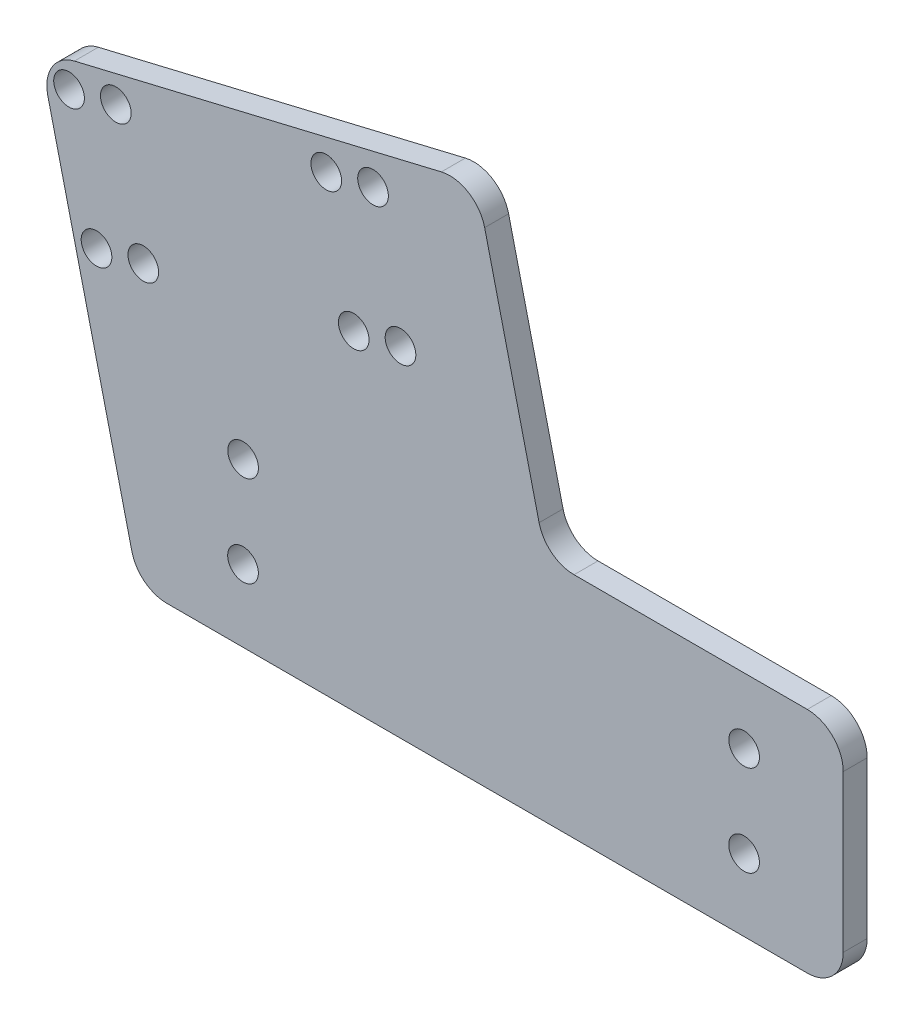
ISO-10303-21;
HEADER;
FILE_DESCRIPTION(('STEP AP214'),'2;1');
FILE_NAME('part.step','',(''),(''),'','','');
FILE_SCHEMA(('AUTOMOTIVE_DESIGN { 1 0 10303 214 1 1 1 1 }'));
ENDSEC;
DATA;
#1=APPLICATION_CONTEXT('core data for automotive mechanical design processes');
#2=APPLICATION_PROTOCOL_DEFINITION('international standard','automotive_design',2000,#1);
#3=PRODUCT_CONTEXT('',#1,'mechanical');
#4=PRODUCT('Part','Part','',(#3));
#5=PRODUCT_RELATED_PRODUCT_CATEGORY('part','',(#4));
#6=PRODUCT_DEFINITION_FORMATION('','',#4);
#7=PRODUCT_DEFINITION_CONTEXT('part definition',#1,'design');
#8=PRODUCT_DEFINITION('design','',#6,#7);
#9=PRODUCT_DEFINITION_SHAPE('','',#8);
#10=(LENGTH_UNIT() NAMED_UNIT(*) SI_UNIT(.MILLI.,.METRE.));
#11=(NAMED_UNIT(*) PLANE_ANGLE_UNIT() SI_UNIT($,.RADIAN.));
#12=(NAMED_UNIT(*) SI_UNIT($,.STERADIAN.) SOLID_ANGLE_UNIT());
#13=UNCERTAINTY_MEASURE_WITH_UNIT(LENGTH_MEASURE(1.E-05),#10,'distance_accuracy_value','');
#14=(GEOMETRIC_REPRESENTATION_CONTEXT(3) GLOBAL_UNCERTAINTY_ASSIGNED_CONTEXT((#13)) GLOBAL_UNIT_ASSIGNED_CONTEXT((#10,
#11,#12)) REPRESENTATION_CONTEXT('',''));
#15=CARTESIAN_POINT('',(0.,0.,0.));
#16=DIRECTION('',(0.,0.,1.));
#17=DIRECTION('',(1.,0.,0.));
#18=AXIS2_PLACEMENT_3D('',#15,#16,#17);
#19=CARTESIAN_POINT('',(0.,0.,3.175));
#20=DIRECTION('',(0.,0.,-1.));
#21=DIRECTION('',(-1.,0.,0.));
#22=AXIS2_PLACEMENT_3D('',#19,#20,#21);
#23=PLANE('',#22);
#24=DIRECTION('',(0.231932512239385,-0.972731879690559,0.));
#25=VECTOR('',#24,1.);
#26=CARTESIAN_POINT('',(-27.4104436947697,-16.4623335026394,3.175));
#27=LINE('',#26,#25);
#28=CARTESIAN_POINT('',(-39.4259118425008,33.9308985796357,3.175));
#29=VERTEX_POINT('',#28);
#30=CARTESIAN_POINT('',(-28.2826171271569,-12.8044120921795,3.175));
#31=VERTEX_POINT('',#30);
#32=EDGE_CURVE('E174',#29,#31,#27,.T.);
#33=ORIENTED_EDGE('',*,*,#32,.T.);
#34=CARTESIAN_POINT('',(-23.6499815501307,-11.6998335026394,3.175));
#35=DIRECTION('',(0.,0.,-1.));
#36=DIRECTION('',(-1.,0.,0.));
#37=AXIS2_PLACEMENT_3D('',#34,#35,#36);
#38=CIRCLE('',#37,4.7625);
#39=CARTESIAN_POINT('',(-23.6499815501307,-16.4623335026394,3.175));
#40=VERTEX_POINT('',#39);
#41=EDGE_CURVE('E193',#31,#40,#38,.F.);
#42=ORIENTED_EDGE('',*,*,#41,.T.);
#43=DIRECTION('',(1.,0.,0.));
#44=VECTOR('',#43,1.);
#45=CARTESIAN_POINT('',(66.017725222861,-16.4623335026394,3.175));
#46=LINE('',#45,#44);
#47=CARTESIAN_POINT('',(61.255225222861,-16.4623335026394,3.175));
#48=VERTEX_POINT('',#47);
#49=EDGE_CURVE('E151',#40,#48,#46,.T.);
#50=ORIENTED_EDGE('',*,*,#49,.T.);
#51=CARTESIAN_POINT('',(61.255225222861,-11.6998335026394,3.175));
#52=DIRECTION('',(0.,0.,-1.));
#53=DIRECTION('',(-1.,0.,0.));
#54=AXIS2_PLACEMENT_3D('',#51,#52,#53);
#55=CIRCLE('',#54,4.7625);
#56=CARTESIAN_POINT('',(66.017725222861,-11.6998335026394,3.175));
#57=VERTEX_POINT('',#56);
#58=EDGE_CURVE('E195',#48,#57,#55,.F.);
#59=ORIENTED_EDGE('',*,*,#58,.T.);
#60=DIRECTION('',(0.,1.,0.));
#61=VECTOR('',#60,1.);
#62=CARTESIAN_POINT('',(66.017725222861,13.8136132691094,3.175));
#63=LINE('',#62,#61);
#64=CARTESIAN_POINT('',(66.017725222861,9.05111326910943,3.175));
#65=VERTEX_POINT('',#64);
#66=EDGE_CURVE('E234',#57,#65,#63,.T.);
#67=ORIENTED_EDGE('',*,*,#66,.T.);
#68=CARTESIAN_POINT('',(61.255225222861,9.05111326910943,3.175));
#69=DIRECTION('',(0.,0.,-1.));
#70=DIRECTION('',(-1.,0.,0.));
#71=AXIS2_PLACEMENT_3D('',#68,#69,#70);
#72=CIRCLE('',#71,4.7625);
#73=CARTESIAN_POINT('',(61.255225222861,13.8136132691094,3.175));
#74=VERTEX_POINT('',#73);
#75=EDGE_CURVE('E189',#65,#74,#72,.F.);
#76=ORIENTED_EDGE('',*,*,#75,.T.);
#77=DIRECTION('',(-1.,0.,0.));
#78=VECTOR('',#77,1.);
#79=CARTESIAN_POINT('',(26.5741517757793,13.8136132691094,3.175));
#80=LINE('',#79,#78);
#81=CARTESIAN_POINT('',(30.3346139204183,13.8136132691094,3.175));
#82=VERTEX_POINT('',#81);
#83=EDGE_CURVE('E229',#74,#82,#80,.T.);
#84=ORIENTED_EDGE('',*,*,#83,.T.);
#85=CARTESIAN_POINT('',(30.3346139204183,18.5761132691094,3.175));
#86=DIRECTION('',(0.,0.,-1.));
#87=DIRECTION('',(-1.,0.,0.));
#88=AXIS2_PLACEMENT_3D('',#85,#86,#87);
#89=CIRCLE('',#88,4.7625);
#90=CARTESIAN_POINT('',(25.7019783433921,17.4715346795693,3.175));
#91=VERTEX_POINT('',#90);
#92=EDGE_CURVE('E11',#82,#91,#89,.T.);
#93=ORIENTED_EDGE('',*,*,#92,.T.);
#94=DIRECTION('',(-0.231932512239385,0.972731879690559,0.));
#95=VECTOR('',#94,1.);
#96=CARTESIAN_POINT('',(17.3806287150141,52.3715234194829,3.175));
#97=LINE('',#96,#95);
#98=CARTESIAN_POINT('',(18.4852073045542,47.7388878424566,3.175));
#99=VERTEX_POINT('',#98);
#100=EDGE_CURVE('E228',#91,#99,#97,.T.);
#101=ORIENTED_EDGE('',*,*,#100,.T.);
#102=CARTESIAN_POINT('',(13.8525717275279,46.6343092529165,3.175));
#103=DIRECTION('',(0.,0.,-1.));
#104=DIRECTION('',(-1.,0.,0.));
#105=AXIS2_PLACEMENT_3D('',#102,#103,#104);
#106=CIRCLE('',#105,4.7625);
#107=CARTESIAN_POINT('',(12.7479931379878,51.2669448299428,3.175));
#108=VERTEX_POINT('',#107);
#109=EDGE_CURVE('E62',#99,#108,#106,.F.);
#110=ORIENTED_EDGE('',*,*,#109,.T.);
#111=DIRECTION('',(-0.972731879690559,-0.231932512239385,0.));
#112=VECTOR('',#111,1.);
#113=CARTESIAN_POINT('',(-40.5304904320408,38.563534156662,3.175));
#114=LINE('',#113,#112);
#115=CARTESIAN_POINT('',(-35.8978548550145,39.6681127462021,3.175));
#116=VERTEX_POINT('',#115);
#117=EDGE_CURVE('E176',#108,#116,#114,.T.);
#118=ORIENTED_EDGE('',*,*,#117,.T.);
#119=CARTESIAN_POINT('',(-34.7932762654745,35.0354771691758,3.175));
#120=DIRECTION('',(0.,0.,-1.));
#121=DIRECTION('',(-1.,0.,0.));
#122=AXIS2_PLACEMENT_3D('',#119,#120,#121);
#123=CIRCLE('',#122,4.7625);
#124=EDGE_CURVE('E190',#116,#29,#123,.F.);
#125=ORIENTED_EDGE('',*,*,#124,.T.);
#126=EDGE_LOOP('',(#33,#42,#50,#59,#67,#76,#84,#93,#101,#110,#118,#125));
#127=FACE_BOUND('',#126,.T.);
#128=CARTESIAN_POINT('',(-36.6096185651346,36.0526458125349,3.175));
#129=DIRECTION('',(0.,0.,1.));
#130=DIRECTION('',(1.,0.,0.));
#131=AXIS2_PLACEMENT_3D('',#128,#129,#130);
#132=CIRCLE('',#131,2.03200000000001);
#133=CARTESIAN_POINT('',(-34.5776185651346,36.0526458125349,3.175));
#134=VERTEX_POINT('',#133);
#135=EDGE_CURVE('E163',#134,#134,#132,.T.);
#136=ORIENTED_EDGE('',*,*,#135,.F.);
#137=EDGE_LOOP('',(#136));
#138=FACE_BOUND('',#137,.T.);
#139=CARTESIAN_POINT('',(-30.410138919923,37.4270373610419,3.175));
#140=DIRECTION('',(0.,0.,1.));
#141=DIRECTION('',(1.,0.,0.));
#142=AXIS2_PLACEMENT_3D('',#139,#140,#141);
#143=CIRCLE('',#142,2.03199999999999);
#144=CARTESIAN_POINT('',(-28.378138919923,37.4270373610419,3.175));
#145=VERTEX_POINT('',#144);
#146=EDGE_CURVE('E244',#145,#145,#143,.T.);
#147=ORIENTED_EDGE('',*,*,#146,.F.);
#148=EDGE_LOOP('',(#147));
#149=FACE_BOUND('',#148,.T.);
#150=CARTESIAN_POINT('',(-32.9674809615911,19.6240247527242,3.175));
#151=DIRECTION('',(0.,0.,1.));
#152=DIRECTION('',(1.,0.,0.));
#153=AXIS2_PLACEMENT_3D('',#150,#151,#152);
#154=CIRCLE('',#153,2.032);
#155=CARTESIAN_POINT('',(-30.9354809615911,19.6240247527242,3.175));
#156=VERTEX_POINT('',#155);
#157=EDGE_CURVE('E253',#156,#156,#154,.T.);
#158=ORIENTED_EDGE('',*,*,#157,.F.);
#159=EDGE_LOOP('',(#158));
#160=FACE_BOUND('',#159,.T.);
#161=CARTESIAN_POINT('',(7.32913673316396,28.5575698180374,3.175));
#162=DIRECTION('',(0.,0.,1.));
#163=DIRECTION('',(1.,0.,0.));
#164=AXIS2_PLACEMENT_3D('',#161,#162,#163);
#165=CIRCLE('',#164,2.03199999999999);
#166=CARTESIAN_POINT('',(9.36113673316396,28.5575698180374,3.175));
#167=VERTEX_POINT('',#166);
#168=EDGE_CURVE('E260',#167,#167,#165,.T.);
#169=ORIENTED_EDGE('',*,*,#168,.F.);
#170=EDGE_LOOP('',(#169));
#171=FACE_BOUND('',#170,.T.);
#172=CARTESIAN_POINT('',(3.68699912962051,44.9861908778481,3.175));
#173=DIRECTION('',(0.,0.,1.));
#174=DIRECTION('',(1.,0.,0.));
#175=AXIS2_PLACEMENT_3D('',#172,#173,#174);
#176=CIRCLE('',#175,2.03199999999998);
#177=CARTESIAN_POINT('',(5.71899912962048,44.9861908778481,3.175));
#178=VERTEX_POINT('',#177);
#179=EDGE_CURVE('E263',#178,#178,#176,.T.);
#180=ORIENTED_EDGE('',*,*,#179,.F.);
#181=EDGE_LOOP('',(#180));
#182=FACE_BOUND('',#181,.T.);
#183=CARTESIAN_POINT('',(-2.51248051559105,43.6117993293412,3.175));
#184=DIRECTION('',(0.,0.,1.));
#185=DIRECTION('',(1.,0.,0.));
#186=AXIS2_PLACEMENT_3D('',#183,#184,#185);
#187=CIRCLE('',#186,2.032);
#188=CARTESIAN_POINT('',(-0.480480515591052,43.6117993293412,3.175));
#189=VERTEX_POINT('',#188);
#190=EDGE_CURVE('E267',#189,#189,#187,.T.);
#191=ORIENTED_EDGE('',*,*,#190,.F.);
#192=EDGE_LOOP('',(#191));
#193=FACE_BOUND('',#192,.T.);
#194=CARTESIAN_POINT('',(1.12965708795237,27.1831782695305,3.175));
#195=DIRECTION('',(0.,0.,1.));
#196=DIRECTION('',(1.,0.,0.));
#197=AXIS2_PLACEMENT_3D('',#194,#195,#196);
#198=CIRCLE('',#197,2.03199999999997);
#199=CARTESIAN_POINT('',(3.16165708795235,27.1831782695305,3.175));
#200=VERTEX_POINT('',#199);
#201=EDGE_CURVE('E274',#200,#200,#198,.T.);
#202=ORIENTED_EDGE('',*,*,#201,.F.);
#203=EDGE_LOOP('',(#202));
#204=FACE_BOUND('',#203,.T.);
#205=CARTESIAN_POINT('',(-26.7680013163795,20.9984163012312,3.175));
#206=DIRECTION('',(0.,0.,1.));
#207=DIRECTION('',(1.,0.,0.));
#208=AXIS2_PLACEMENT_3D('',#205,#206,#207);
#209=CIRCLE('',#208,2.032);
#210=CARTESIAN_POINT('',(-24.7360013163795,20.9984163012312,3.175));
#211=VERTEX_POINT('',#210);
#212=EDGE_CURVE('E281',#211,#211,#209,.T.);
#213=ORIENTED_EDGE('',*,*,#212,.F.);
#214=EDGE_LOOP('',(#213));
#215=FACE_BOUND('',#214,.T.);
#216=CARTESIAN_POINT('',(52.883061118148,5.13586566594492,3.175));
#217=DIRECTION('',(0.,0.,1.));
#218=DIRECTION('',(1.74155309596097E-13,1.,0.));
#219=AXIS2_PLACEMENT_3D('',#216,#217,#218);
#220=ELLIPSE('',#219,2.032,2.03199950216018);
#221=CARTESIAN_POINT('',(52.8830611181484,7.16786566594492,3.175));
#222=VERTEX_POINT('',#221);
#223=EDGE_CURVE('E290',#222,#222,#220,.T.);
#224=ORIENTED_EDGE('',*,*,#223,.F.);
#225=EDGE_LOOP('',(#224));
#226=FACE_BOUND('',#225,.T.);
#227=CARTESIAN_POINT('',(52.8750601201143,-6.9291343340733,3.175));
#228=DIRECTION('',(0.,0.,1.));
#229=DIRECTION('',(1.,0.,0.));
#230=AXIS2_PLACEMENT_3D('',#227,#228,#229);
#231=CIRCLE('',#230,2.03200000000001);
#232=CARTESIAN_POINT('',(54.9070601201143,-6.9291343340733,3.175));
#233=VERTEX_POINT('',#232);
#234=EDGE_CURVE('E291',#233,#233,#231,.T.);
#235=ORIENTED_EDGE('',*,*,#234,.F.);
#236=EDGE_LOOP('',(#235));
#237=FACE_BOUND('',#236,.T.);
#238=CARTESIAN_POINT('',(-13.5459236067466,-6.9291343340733,3.175));
#239=DIRECTION('',(0.,0.,1.));
#240=DIRECTION('',(1.,0.,0.));
#241=AXIS2_PLACEMENT_3D('',#238,#239,#240);
#242=CIRCLE('',#241,2.03200000000001);
#243=CARTESIAN_POINT('',(-11.5139236067466,-6.9291343340733,3.175));
#244=VERTEX_POINT('',#243);
#245=EDGE_CURVE('E574',#244,#244,#242,.T.);
#246=ORIENTED_EDGE('',*,*,#245,.F.);
#247=EDGE_LOOP('',(#246));
#248=FACE_BOUND('',#247,.T.);
#249=CARTESIAN_POINT('',(-13.5379226087129,5.13586566594492,3.175));
#250=DIRECTION('',(0.,0.,1.));
#251=DIRECTION('',(1.75009012094116E-13,1.,0.));
#252=AXIS2_PLACEMENT_3D('',#249,#250,#251);
#253=ELLIPSE('',#252,2.03200000000001,2.03199950216019);
#254=CARTESIAN_POINT('',(-13.5379226087125,7.16786566594492,3.175));
#255=VERTEX_POINT('',#254);
#256=EDGE_CURVE('E583',#255,#255,#253,.T.);
#257=ORIENTED_EDGE('',*,*,#256,.F.);
#258=EDGE_LOOP('',(#257));
#259=FACE_BOUND('',#258,.T.);
#260=ADVANCED_FACE('F41',(#127,#138,#149,#160,#171,#182,#193,#204,#215,#226,#237,#248,#259),#23,.F.);
#261=CARTESIAN_POINT('',(0.,0.,0.));
#262=DIRECTION('',(0.,0.,-1.));
#263=DIRECTION('',(-1.,0.,0.));
#264=AXIS2_PLACEMENT_3D('',#261,#262,#263);
#265=PLANE('',#264);
#266=CARTESIAN_POINT('',(-13.5459236067466,-6.9291343340733,0.));
#267=DIRECTION('',(0.,0.,1.));
#268=DIRECTION('',(1.,0.,0.));
#269=AXIS2_PLACEMENT_3D('',#266,#267,#268);
#270=CIRCLE('',#269,2.03200000000001);
#271=CARTESIAN_POINT('',(-11.5139236067466,-6.9291343340733,0.));
#272=VERTEX_POINT('',#271);
#273=EDGE_CURVE('E580',#272,#272,#270,.T.);
#274=ORIENTED_EDGE('',*,*,#273,.T.);
#275=EDGE_LOOP('',(#274));
#276=FACE_BOUND('',#275,.T.);
#277=CARTESIAN_POINT('',(52.883061118148,5.13586566594492,0.));
#278=DIRECTION('',(0.,0.,1.));
#279=DIRECTION('',(1.74155309596097E-13,1.,0.));
#280=AXIS2_PLACEMENT_3D('',#277,#278,#279);
#281=ELLIPSE('',#280,2.032,2.03199950216018);
#282=CARTESIAN_POINT('',(52.8830611181484,7.16786566594492,0.));
#283=VERTEX_POINT('',#282);
#284=EDGE_CURVE('E289',#283,#283,#281,.T.);
#285=ORIENTED_EDGE('',*,*,#284,.T.);
#286=EDGE_LOOP('',(#285));
#287=FACE_BOUND('',#286,.T.);
#288=CARTESIAN_POINT('',(1.12965708795237,27.1831782695305,0.));
#289=DIRECTION('',(0.,0.,1.));
#290=DIRECTION('',(1.,0.,0.));
#291=AXIS2_PLACEMENT_3D('',#288,#289,#290);
#292=CIRCLE('',#291,2.03199999999997);
#293=CARTESIAN_POINT('',(3.16165708795235,27.1831782695305,0.));
#294=VERTEX_POINT('',#293);
#295=EDGE_CURVE('E279',#294,#294,#292,.T.);
#296=ORIENTED_EDGE('',*,*,#295,.T.);
#297=EDGE_LOOP('',(#296));
#298=FACE_BOUND('',#297,.T.);
#299=CARTESIAN_POINT('',(3.68699912962051,44.9861908778481,0.));
#300=DIRECTION('',(0.,0.,1.));
#301=DIRECTION('',(1.,0.,0.));
#302=AXIS2_PLACEMENT_3D('',#299,#300,#301);
#303=CIRCLE('',#302,2.03199999999998);
#304=CARTESIAN_POINT('',(5.71899912962048,44.9861908778481,0.));
#305=VERTEX_POINT('',#304);
#306=EDGE_CURVE('E266',#305,#305,#303,.T.);
#307=ORIENTED_EDGE('',*,*,#306,.T.);
#308=EDGE_LOOP('',(#307));
#309=FACE_BOUND('',#308,.T.);
#310=CARTESIAN_POINT('',(-32.9674809615911,19.6240247527242,0.));
#311=DIRECTION('',(0.,0.,1.));
#312=DIRECTION('',(1.,0.,0.));
#313=AXIS2_PLACEMENT_3D('',#310,#311,#312);
#314=CIRCLE('',#313,2.032);
#315=CARTESIAN_POINT('',(-30.9354809615911,19.6240247527242,0.));
#316=VERTEX_POINT('',#315);
#317=EDGE_CURVE('E255',#316,#316,#314,.T.);
#318=ORIENTED_EDGE('',*,*,#317,.T.);
#319=EDGE_LOOP('',(#318));
#320=FACE_BOUND('',#319,.T.);
#321=CARTESIAN_POINT('',(-36.6096185651346,36.0526458125349,0.));
#322=DIRECTION('',(0.,0.,1.));
#323=DIRECTION('',(1.,0.,0.));
#324=AXIS2_PLACEMENT_3D('',#321,#322,#323);
#325=CIRCLE('',#324,2.03200000000001);
#326=CARTESIAN_POINT('',(-34.5776185651346,36.0526458125349,0.));
#327=VERTEX_POINT('',#326);
#328=EDGE_CURVE('E245',#327,#327,#325,.T.);
#329=ORIENTED_EDGE('',*,*,#328,.T.);
#330=EDGE_LOOP('',(#329));
#331=FACE_BOUND('',#330,.T.);
#332=DIRECTION('',(1.,0.,0.));
#333=VECTOR('',#332,1.);
#334=CARTESIAN_POINT('',(66.017725222861,-16.4623335026394,0.));
#335=LINE('',#334,#333);
#336=CARTESIAN_POINT('',(-23.6499815501307,-16.4623335026394,0.));
#337=VERTEX_POINT('',#336);
#338=CARTESIAN_POINT('',(61.255225222861,-16.4623335026394,0.));
#339=VERTEX_POINT('',#338);
#340=EDGE_CURVE('E146',#337,#339,#335,.T.);
#341=ORIENTED_EDGE('',*,*,#340,.F.);
#342=CARTESIAN_POINT('',(-23.6499815501307,-11.6998335026394,0.));
#343=DIRECTION('',(0.,0.,-1.));
#344=DIRECTION('',(-1.,0.,0.));
#345=AXIS2_PLACEMENT_3D('',#342,#343,#344);
#346=CIRCLE('',#345,4.7625);
#347=CARTESIAN_POINT('',(-28.2826171271569,-12.8044120921795,0.));
#348=VERTEX_POINT('',#347);
#349=EDGE_CURVE('E131',#337,#348,#346,.T.);
#350=ORIENTED_EDGE('',*,*,#349,.T.);
#351=DIRECTION('',(0.231932512239385,-0.972731879690559,0.));
#352=VECTOR('',#351,1.);
#353=CARTESIAN_POINT('',(-27.4104436947697,-16.4623335026394,0.));
#354=LINE('',#353,#352);
#355=CARTESIAN_POINT('',(-39.4259118425008,33.9308985796357,0.));
#356=VERTEX_POINT('',#355);
#357=EDGE_CURVE('E157',#356,#348,#354,.T.);
#358=ORIENTED_EDGE('',*,*,#357,.F.);
#359=CARTESIAN_POINT('',(-34.7932762654745,35.0354771691758,0.));
#360=DIRECTION('',(0.,0.,-1.));
#361=DIRECTION('',(-1.,0.,0.));
#362=AXIS2_PLACEMENT_3D('',#359,#360,#361);
#363=CIRCLE('',#362,4.7625);
#364=CARTESIAN_POINT('',(-35.8978548550145,39.6681127462021,0.));
#365=VERTEX_POINT('',#364);
#366=EDGE_CURVE('E155',#356,#365,#363,.T.);
#367=ORIENTED_EDGE('',*,*,#366,.T.);
#368=DIRECTION('',(-0.972731879690559,-0.231932512239385,0.));
#369=VECTOR('',#368,1.);
#370=CARTESIAN_POINT('',(-40.5304904320408,38.563534156662,0.));
#371=LINE('',#370,#369);
#372=CARTESIAN_POINT('',(12.7479931379878,51.2669448299428,0.));
#373=VERTEX_POINT('',#372);
#374=EDGE_CURVE('E172',#373,#365,#371,.T.);
#375=ORIENTED_EDGE('',*,*,#374,.F.);
#376=CARTESIAN_POINT('',(13.8525717275279,46.6343092529165,0.));
#377=DIRECTION('',(0.,0.,-1.));
#378=DIRECTION('',(-1.,0.,0.));
#379=AXIS2_PLACEMENT_3D('',#376,#377,#378);
#380=CIRCLE('',#379,4.7625);
#381=CARTESIAN_POINT('',(18.4852073045542,47.7388878424566,0.));
#382=VERTEX_POINT('',#381);
#383=EDGE_CURVE('E178',#373,#382,#380,.T.);
#384=ORIENTED_EDGE('',*,*,#383,.T.);
#385=DIRECTION('',(-0.231932512239385,0.972731879690559,0.));
#386=VECTOR('',#385,1.);
#387=CARTESIAN_POINT('',(17.3806287150141,52.3715234194829,0.));
#388=LINE('',#387,#386);
#389=CARTESIAN_POINT('',(25.7019783433921,17.4715346795693,0.));
#390=VERTEX_POINT('',#389);
#391=EDGE_CURVE('E168',#390,#382,#388,.T.);
#392=ORIENTED_EDGE('',*,*,#391,.F.);
#393=CARTESIAN_POINT('',(30.3346139204183,18.5761132691094,0.));
#394=DIRECTION('',(0.,0.,-1.));
#395=DIRECTION('',(-1.,0.,0.));
#396=AXIS2_PLACEMENT_3D('',#393,#394,#395);
#397=CIRCLE('',#396,4.7625);
#398=CARTESIAN_POINT('',(30.3346139204183,13.8136132691094,0.));
#399=VERTEX_POINT('',#398);
#400=EDGE_CURVE('E47',#390,#399,#397,.F.);
#401=ORIENTED_EDGE('',*,*,#400,.T.);
#402=DIRECTION('',(-1.,0.,0.));
#403=VECTOR('',#402,1.);
#404=CARTESIAN_POINT('',(26.5741517757793,13.8136132691094,0.));
#405=LINE('',#404,#403);
#406=CARTESIAN_POINT('',(61.255225222861,13.8136132691094,0.));
#407=VERTEX_POINT('',#406);
#408=EDGE_CURVE('E165',#407,#399,#405,.T.);
#409=ORIENTED_EDGE('',*,*,#408,.F.);
#410=CARTESIAN_POINT('',(61.255225222861,9.05111326910943,0.));
#411=DIRECTION('',(0.,0.,-1.));
#412=DIRECTION('',(-1.,0.,0.));
#413=AXIS2_PLACEMENT_3D('',#410,#411,#412);
#414=CIRCLE('',#413,4.7625);
#415=CARTESIAN_POINT('',(66.017725222861,9.05111326910943,0.));
#416=VERTEX_POINT('',#415);
#417=EDGE_CURVE('E182',#407,#416,#414,.T.);
#418=ORIENTED_EDGE('',*,*,#417,.T.);
#419=DIRECTION('',(0.,1.,0.));
#420=VECTOR('',#419,1.);
#421=CARTESIAN_POINT('',(66.017725222861,13.8136132691094,0.));
#422=LINE('',#421,#420);
#423=CARTESIAN_POINT('',(66.017725222861,-11.6998335026394,0.));
#424=VERTEX_POINT('',#423);
#425=EDGE_CURVE('E158',#424,#416,#422,.T.);
#426=ORIENTED_EDGE('',*,*,#425,.F.);
#427=CARTESIAN_POINT('',(61.255225222861,-11.6998335026394,0.));
#428=DIRECTION('',(0.,0.,-1.));
#429=DIRECTION('',(-1.,0.,0.));
#430=AXIS2_PLACEMENT_3D('',#427,#428,#429);
#431=CIRCLE('',#430,4.7625);
#432=EDGE_CURVE('E142',#424,#339,#431,.T.);
#433=ORIENTED_EDGE('',*,*,#432,.T.);
#434=EDGE_LOOP('',(#341,#350,#358,#367,#375,#384,#392,#401,#409,#418,#426,#433));
#435=FACE_BOUND('',#434,.T.);
#436=CARTESIAN_POINT('',(-30.410138919923,37.4270373610419,0.));
#437=DIRECTION('',(0.,0.,1.));
#438=DIRECTION('',(1.,0.,0.));
#439=AXIS2_PLACEMENT_3D('',#436,#437,#438);
#440=CIRCLE('',#439,2.03199999999999);
#441=CARTESIAN_POINT('',(-28.378138919923,37.4270373610419,0.));
#442=VERTEX_POINT('',#441);
#443=EDGE_CURVE('E247',#442,#442,#440,.T.);
#444=ORIENTED_EDGE('',*,*,#443,.T.);
#445=EDGE_LOOP('',(#444));
#446=FACE_BOUND('',#445,.T.);
#447=CARTESIAN_POINT('',(7.32913673316396,28.5575698180374,0.));
#448=DIRECTION('',(0.,0.,1.));
#449=DIRECTION('',(1.,0.,0.));
#450=AXIS2_PLACEMENT_3D('',#447,#448,#449);
#451=CIRCLE('',#450,2.03199999999999);
#452=CARTESIAN_POINT('',(9.36113673316396,28.5575698180374,0.));
#453=VERTEX_POINT('',#452);
#454=EDGE_CURVE('E257',#453,#453,#451,.T.);
#455=ORIENTED_EDGE('',*,*,#454,.T.);
#456=EDGE_LOOP('',(#455));
#457=FACE_BOUND('',#456,.T.);
#458=CARTESIAN_POINT('',(-2.51248051559105,43.6117993293412,0.));
#459=DIRECTION('',(0.,0.,1.));
#460=DIRECTION('',(1.,0.,0.));
#461=AXIS2_PLACEMENT_3D('',#458,#459,#460);
#462=CIRCLE('',#461,2.032);
#463=CARTESIAN_POINT('',(-0.480480515591052,43.6117993293412,0.));
#464=VERTEX_POINT('',#463);
#465=EDGE_CURVE('E275',#464,#464,#462,.T.);
#466=ORIENTED_EDGE('',*,*,#465,.T.);
#467=EDGE_LOOP('',(#466));
#468=FACE_BOUND('',#467,.T.);
#469=CARTESIAN_POINT('',(-26.7680013163795,20.9984163012312,0.));
#470=DIRECTION('',(0.,0.,1.));
#471=DIRECTION('',(1.,0.,0.));
#472=AXIS2_PLACEMENT_3D('',#469,#470,#471);
#473=CIRCLE('',#472,2.032);
#474=CARTESIAN_POINT('',(-24.7360013163795,20.9984163012312,0.));
#475=VERTEX_POINT('',#474);
#476=EDGE_CURVE('E283',#475,#475,#473,.T.);
#477=ORIENTED_EDGE('',*,*,#476,.T.);
#478=EDGE_LOOP('',(#477));
#479=FACE_BOUND('',#478,.T.);
#480=CARTESIAN_POINT('',(52.8750601201143,-6.9291343340733,0.));
#481=DIRECTION('',(0.,0.,1.));
#482=DIRECTION('',(1.,0.,0.));
#483=AXIS2_PLACEMENT_3D('',#480,#481,#482);
#484=CIRCLE('',#483,2.03200000000001);
#485=CARTESIAN_POINT('',(54.9070601201143,-6.9291343340733,0.));
#486=VERTEX_POINT('',#485);
#487=EDGE_CURVE('E300',#486,#486,#484,.T.);
#488=ORIENTED_EDGE('',*,*,#487,.T.);
#489=EDGE_LOOP('',(#488));
#490=FACE_BOUND('',#489,.T.);
#491=CARTESIAN_POINT('',(-13.5379226087129,5.13586566594492,0.));
#492=DIRECTION('',(0.,0.,1.));
#493=DIRECTION('',(1.75009012094116E-13,1.,0.));
#494=AXIS2_PLACEMENT_3D('',#491,#492,#493);
#495=ELLIPSE('',#494,2.03200000000001,2.03199950216019);
#496=CARTESIAN_POINT('',(-13.5379226087125,7.16786566594492,0.));
#497=VERTEX_POINT('',#496);
#498=EDGE_CURVE('E585',#497,#497,#495,.T.);
#499=ORIENTED_EDGE('',*,*,#498,.T.);
#500=EDGE_LOOP('',(#499));
#501=FACE_BOUND('',#500,.T.);
#502=ADVANCED_FACE('F154',(#276,#287,#298,#309,#320,#331,#435,#446,#457,#468,#479,#490,#501),
#265,.T.);
#503=CARTESIAN_POINT('',(-27.4104436947697,-16.4623335026394,3.175));
#504=DIRECTION('',(0.972731879690559,0.231932512239385,0.));
#505=DIRECTION('',(-0.231932512239385,0.972731879690559,0.));
#506=AXIS2_PLACEMENT_3D('',#503,#504,#505);
#507=PLANE('',#506);
#508=ORIENTED_EDGE('',*,*,#357,.T.);
#509=DIRECTION('',(0.,0.,-1.));
#510=VECTOR('',#509,1.);
#511=CARTESIAN_POINT('',(-28.2826171271569,-12.8044120921795,3.175));
#512=LINE('',#511,#510);
#513=EDGE_CURVE('E136',#348,#31,#512,.F.);
#514=ORIENTED_EDGE('',*,*,#513,.T.);
#515=ORIENTED_EDGE('',*,*,#32,.F.);
#516=DIRECTION('',(0.,0.,-1.));
#517=VECTOR('',#516,1.);
#518=CARTESIAN_POINT('',(-39.4259118425008,33.9308985796357,3.175));
#519=LINE('',#518,#517);
#520=EDGE_CURVE('E143',#29,#356,#519,.T.);
#521=ORIENTED_EDGE('',*,*,#520,.T.);
#522=EDGE_LOOP('',(#508,#514,#515,#521));
#523=FACE_BOUND('',#522,.T.);
#524=ADVANCED_FACE('F343',(#523),#507,.F.);
#525=CARTESIAN_POINT('',(66.017725222861,-16.4623335026394,3.175));
#526=DIRECTION('',(0.,1.,0.));
#527=DIRECTION('',(0.,0.,1.));
#528=AXIS2_PLACEMENT_3D('',#525,#526,#527);
#529=PLANE('',#528);
#530=ORIENTED_EDGE('',*,*,#49,.F.);
#531=DIRECTION('',(0.,0.,-1.));
#532=VECTOR('',#531,1.);
#533=CARTESIAN_POINT('',(-23.6499815501307,-16.4623335026394,3.175));
#534=LINE('',#533,#532);
#535=EDGE_CURVE('E134',#40,#337,#534,.T.);
#536=ORIENTED_EDGE('',*,*,#535,.T.);
#537=ORIENTED_EDGE('',*,*,#340,.T.);
#538=DIRECTION('',(0.,0.,-1.));
#539=VECTOR('',#538,1.);
#540=CARTESIAN_POINT('',(61.255225222861,-16.4623335026394,3.175));
#541=LINE('',#540,#539);
#542=EDGE_CURVE('E153',#339,#48,#541,.F.);
#543=ORIENTED_EDGE('',*,*,#542,.T.);
#544=EDGE_LOOP('',(#530,#536,#537,#543));
#545=FACE_BOUND('',#544,.T.);
#546=ADVANCED_FACE('F150',(#545),#529,.F.);
#547=CARTESIAN_POINT('',(66.017725222861,13.8136132691094,3.175));
#548=DIRECTION('',(-1.,0.,0.));
#549=DIRECTION('',(0.,0.,1.));
#550=AXIS2_PLACEMENT_3D('',#547,#548,#549);
#551=PLANE('',#550);
#552=ORIENTED_EDGE('',*,*,#66,.F.);
#553=DIRECTION('',(0.,0.,-1.));
#554=VECTOR('',#553,1.);
#555=CARTESIAN_POINT('',(66.017725222861,-11.6998335026394,3.175));
#556=LINE('',#555,#554);
#557=EDGE_CURVE('E196',#57,#424,#556,.T.);
#558=ORIENTED_EDGE('',*,*,#557,.T.);
#559=ORIENTED_EDGE('',*,*,#425,.T.);
#560=DIRECTION('',(0.,0.,-1.));
#561=VECTOR('',#560,1.);
#562=CARTESIAN_POINT('',(66.017725222861,9.05111326910943,3.175));
#563=LINE('',#562,#561);
#564=EDGE_CURVE('E198',#416,#65,#563,.F.);
#565=ORIENTED_EDGE('',*,*,#564,.T.);
#566=EDGE_LOOP('',(#552,#558,#559,#565));
#567=FACE_BOUND('',#566,.T.);
#568=ADVANCED_FACE('F355',(#567),#551,.F.);
#569=CARTESIAN_POINT('',(26.5741517757793,13.8136132691094,3.175));
#570=DIRECTION('',(0.,-1.,0.));
#571=DIRECTION('',(0.,0.,-1.));
#572=AXIS2_PLACEMENT_3D('',#569,#570,#571);
#573=PLANE('',#572);
#574=ORIENTED_EDGE('',*,*,#83,.F.);
#575=DIRECTION('',(0.,0.,-1.));
#576=VECTOR('',#575,1.);
#577=CARTESIAN_POINT('',(61.255225222861,13.8136132691094,3.175));
#578=LINE('',#577,#576);
#579=EDGE_CURVE('E201',#74,#407,#578,.T.);
#580=ORIENTED_EDGE('',*,*,#579,.T.);
#581=ORIENTED_EDGE('',*,*,#408,.T.);
#582=DIRECTION('',(0.,0.,-1.));
#583=VECTOR('',#582,1.);
#584=CARTESIAN_POINT('',(30.3346139204183,13.8136132691094,3.175));
#585=LINE('',#584,#583);
#586=EDGE_CURVE('E203',#399,#82,#585,.F.);
#587=ORIENTED_EDGE('',*,*,#586,.T.);
#588=EDGE_LOOP('',(#574,#580,#581,#587));
#589=FACE_BOUND('',#588,.T.);
#590=ADVANCED_FACE('F222',(#589),#573,.F.);
#591=CARTESIAN_POINT('',(17.3806287150141,52.3715234194829,3.175));
#592=DIRECTION('',(-0.972731879690559,-0.231932512239385,0.));
#593=DIRECTION('',(0.231932512239385,-0.972731879690559,0.));
#594=AXIS2_PLACEMENT_3D('',#591,#592,#593);
#595=PLANE('',#594);
#596=ORIENTED_EDGE('',*,*,#100,.F.);
#597=DIRECTION('',(0.,0.,-1.));
#598=VECTOR('',#597,1.);
#599=CARTESIAN_POINT('',(25.7019783433921,17.4715346795694,0.));
#600=LINE('',#599,#598);
#601=EDGE_CURVE('E208',#91,#390,#600,.T.);
#602=ORIENTED_EDGE('',*,*,#601,.T.);
#603=ORIENTED_EDGE('',*,*,#391,.T.);
#604=DIRECTION('',(0.,0.,-1.));
#605=VECTOR('',#604,1.);
#606=CARTESIAN_POINT('',(18.4852073045542,47.7388878424566,3.175));
#607=LINE('',#606,#605);
#608=EDGE_CURVE('E206',#382,#99,#607,.F.);
#609=ORIENTED_EDGE('',*,*,#608,.T.);
#610=EDGE_LOOP('',(#596,#602,#603,#609));
#611=FACE_BOUND('',#610,.T.);
#612=ADVANCED_FACE('F235',(#611),#595,.F.);
#613=CARTESIAN_POINT('',(-40.5304904320408,38.563534156662,3.175));
#614=DIRECTION('',(0.231932512239385,-0.972731879690559,0.));
#615=DIRECTION('',(0.972731879690559,0.231932512239385,0.));
#616=AXIS2_PLACEMENT_3D('',#613,#614,#615);
#617=PLANE('',#616);
#618=ORIENTED_EDGE('',*,*,#117,.F.);
#619=DIRECTION('',(0.,0.,-1.));
#620=VECTOR('',#619,1.);
#621=CARTESIAN_POINT('',(12.7479931379878,51.2669448299428,3.175));
#622=LINE('',#621,#620);
#623=EDGE_CURVE('E215',#108,#373,#622,.T.);
#624=ORIENTED_EDGE('',*,*,#623,.T.);
#625=ORIENTED_EDGE('',*,*,#374,.T.);
#626=DIRECTION('',(0.,0.,-1.));
#627=VECTOR('',#626,1.);
#628=CARTESIAN_POINT('',(-35.8978548550145,39.6681127462021,3.175));
#629=LINE('',#628,#627);
#630=EDGE_CURVE('E57',#365,#116,#629,.F.);
#631=ORIENTED_EDGE('',*,*,#630,.T.);
#632=EDGE_LOOP('',(#618,#624,#625,#631));
#633=FACE_BOUND('',#632,.T.);
#634=ADVANCED_FACE('F337',(#633),#617,.F.);
#635=CARTESIAN_POINT('',(-36.6096185651346,36.0526458125349,3.175));
#636=DIRECTION('',(0.,0.,-1.));
#637=DIRECTION('',(-1.,0.,0.));
#638=AXIS2_PLACEMENT_3D('',#635,#636,#637);
#639=CYLINDRICAL_SURFACE('',#638,2.03200000000001);
#640=ORIENTED_EDGE('',*,*,#135,.T.);
#641=EDGE_LOOP('',(#640));
#642=FACE_BOUND('',#641,.T.);
#643=ORIENTED_EDGE('',*,*,#328,.F.);
#644=EDGE_LOOP('',(#643));
#645=FACE_BOUND('',#644,.T.);
#646=ADVANCED_FACE('F331',(#642,#645),#639,.F.);
#647=CARTESIAN_POINT('',(-30.410138919923,37.4270373610419,3.175));
#648=DIRECTION('',(0.,0.,-1.));
#649=DIRECTION('',(-1.,0.,0.));
#650=AXIS2_PLACEMENT_3D('',#647,#648,#649);
#651=CYLINDRICAL_SURFACE('',#650,2.03199999999999);
#652=ORIENTED_EDGE('',*,*,#146,.T.);
#653=EDGE_LOOP('',(#652));
#654=FACE_BOUND('',#653,.T.);
#655=ORIENTED_EDGE('',*,*,#443,.F.);
#656=EDGE_LOOP('',(#655));
#657=FACE_BOUND('',#656,.T.);
#658=ADVANCED_FACE('F329',(#654,#657),#651,.F.);
#659=CARTESIAN_POINT('',(-32.9674809615911,19.6240247527242,3.175));
#660=DIRECTION('',(0.,0.,-1.));
#661=DIRECTION('',(-1.,0.,0.));
#662=AXIS2_PLACEMENT_3D('',#659,#660,#661);
#663=CYLINDRICAL_SURFACE('',#662,2.032);
#664=ORIENTED_EDGE('',*,*,#157,.T.);
#665=EDGE_LOOP('',(#664));
#666=FACE_BOUND('',#665,.T.);
#667=ORIENTED_EDGE('',*,*,#317,.F.);
#668=EDGE_LOOP('',(#667));
#669=FACE_BOUND('',#668,.T.);
#670=ADVANCED_FACE('F326',(#666,#669),#663,.F.);
#671=CARTESIAN_POINT('',(7.32913673316396,28.5575698180374,3.175));
#672=DIRECTION('',(0.,0.,-1.));
#673=DIRECTION('',(-1.,0.,0.));
#674=AXIS2_PLACEMENT_3D('',#671,#672,#673);
#675=CYLINDRICAL_SURFACE('',#674,2.03199999999999);
#676=ORIENTED_EDGE('',*,*,#454,.F.);
#677=EDGE_LOOP('',(#676));
#678=FACE_BOUND('',#677,.T.);
#679=ORIENTED_EDGE('',*,*,#168,.T.);
#680=EDGE_LOOP('',(#679));
#681=FACE_BOUND('',#680,.T.);
#682=ADVANCED_FACE('F325',(#678,#681),#675,.F.);
#683=CARTESIAN_POINT('',(3.68699912962051,44.9861908778481,3.175));
#684=DIRECTION('',(0.,0.,-1.));
#685=DIRECTION('',(-1.,0.,0.));
#686=AXIS2_PLACEMENT_3D('',#683,#684,#685);
#687=CYLINDRICAL_SURFACE('',#686,2.03199999999998);
#688=ORIENTED_EDGE('',*,*,#306,.F.);
#689=EDGE_LOOP('',(#688));
#690=FACE_BOUND('',#689,.T.);
#691=ORIENTED_EDGE('',*,*,#179,.T.);
#692=EDGE_LOOP('',(#691));
#693=FACE_BOUND('',#692,.T.);
#694=ADVANCED_FACE('F318',(#690,#693),#687,.F.);
#695=CARTESIAN_POINT('',(-2.51248051559105,43.6117993293412,3.175));
#696=DIRECTION('',(0.,0.,-1.));
#697=DIRECTION('',(-1.,0.,0.));
#698=AXIS2_PLACEMENT_3D('',#695,#696,#697);
#699=CYLINDRICAL_SURFACE('',#698,2.032);
#700=ORIENTED_EDGE('',*,*,#465,.F.);
#701=EDGE_LOOP('',(#700));
#702=FACE_BOUND('',#701,.T.);
#703=ORIENTED_EDGE('',*,*,#190,.T.);
#704=EDGE_LOOP('',(#703));
#705=FACE_BOUND('',#704,.T.);
#706=ADVANCED_FACE('F314',(#702,#705),#699,.F.);
#707=CARTESIAN_POINT('',(1.12965708795237,27.1831782695305,3.175));
#708=DIRECTION('',(0.,0.,-1.));
#709=DIRECTION('',(-1.,0.,0.));
#710=AXIS2_PLACEMENT_3D('',#707,#708,#709);
#711=CYLINDRICAL_SURFACE('',#710,2.03199999999997);
#712=ORIENTED_EDGE('',*,*,#295,.F.);
#713=EDGE_LOOP('',(#712));
#714=FACE_BOUND('',#713,.T.);
#715=ORIENTED_EDGE('',*,*,#201,.T.);
#716=EDGE_LOOP('',(#715));
#717=FACE_BOUND('',#716,.T.);
#718=ADVANCED_FACE('F309',(#714,#717),#711,.F.);
#719=CARTESIAN_POINT('',(-26.7680013163795,20.9984163012312,3.175));
#720=DIRECTION('',(0.,0.,-1.));
#721=DIRECTION('',(-1.,0.,0.));
#722=AXIS2_PLACEMENT_3D('',#719,#720,#721);
#723=CYLINDRICAL_SURFACE('',#722,2.032);
#724=ORIENTED_EDGE('',*,*,#476,.F.);
#725=EDGE_LOOP('',(#724));
#726=FACE_BOUND('',#725,.T.);
#727=ORIENTED_EDGE('',*,*,#212,.T.);
#728=EDGE_LOOP('',(#727));
#729=FACE_BOUND('',#728,.T.);
#730=ADVANCED_FACE('F304',(#726,#729),#723,.F.);
#731=DIRECTION('',(0.,0.,-1.));
#732=VECTOR('',#731,1.);
#733=SURFACE_OF_LINEAR_EXTRUSION('',#220,#732);
#734=ORIENTED_EDGE('',*,*,#223,.T.);
#735=EDGE_LOOP('',(#734));
#736=FACE_BOUND('',#735,.T.);
#737=ORIENTED_EDGE('',*,*,#284,.F.);
#738=EDGE_LOOP('',(#737));
#739=FACE_BOUND('',#738,.T.);
#740=ADVANCED_FACE('F299',(#736,#739),#733,.T.);
#741=CARTESIAN_POINT('',(52.8750601201143,-6.9291343340733,3.175));
#742=DIRECTION('',(0.,0.,-1.));
#743=DIRECTION('',(-1.,0.,0.));
#744=AXIS2_PLACEMENT_3D('',#741,#742,#743);
#745=CYLINDRICAL_SURFACE('',#744,2.03200000000001);
#746=ORIENTED_EDGE('',*,*,#234,.T.);
#747=EDGE_LOOP('',(#746));
#748=FACE_BOUND('',#747,.T.);
#749=ORIENTED_EDGE('',*,*,#487,.F.);
#750=EDGE_LOOP('',(#749));
#751=FACE_BOUND('',#750,.T.);
#752=ADVANCED_FACE('F303',(#748,#751),#745,.F.);
#753=CARTESIAN_POINT('',(-13.5459236067466,-6.9291343340733,3.175));
#754=DIRECTION('',(0.,0.,-1.));
#755=DIRECTION('',(-1.,0.,0.));
#756=AXIS2_PLACEMENT_3D('',#753,#754,#755);
#757=CYLINDRICAL_SURFACE('',#756,2.03200000000001);
#758=ORIENTED_EDGE('',*,*,#245,.T.);
#759=EDGE_LOOP('',(#758));
#760=FACE_BOUND('',#759,.T.);
#761=ORIENTED_EDGE('',*,*,#273,.F.);
#762=EDGE_LOOP('',(#761));
#763=FACE_BOUND('',#762,.T.);
#764=ADVANCED_FACE('F429',(#760,#763),#757,.F.);
#765=DIRECTION('',(0.,0.,-1.));
#766=VECTOR('',#765,1.);
#767=SURFACE_OF_LINEAR_EXTRUSION('',#253,#766);
#768=ORIENTED_EDGE('',*,*,#256,.T.);
#769=EDGE_LOOP('',(#768));
#770=FACE_BOUND('',#769,.T.);
#771=ORIENTED_EDGE('',*,*,#498,.F.);
#772=EDGE_LOOP('',(#771));
#773=FACE_BOUND('',#772,.T.);
#774=ADVANCED_FACE('F365',(#770,#773),#767,.T.);
#775=CARTESIAN_POINT('',(-23.6499815501307,-11.6998335026394,3.175));
#776=DIRECTION('',(0.,0.,-1.));
#777=DIRECTION('',(-1.,0.,0.));
#778=AXIS2_PLACEMENT_3D('',#775,#776,#777);
#779=CYLINDRICAL_SURFACE('',#778,4.7625);
#780=ORIENTED_EDGE('',*,*,#41,.F.);
#781=ORIENTED_EDGE('',*,*,#513,.F.);
#782=ORIENTED_EDGE('',*,*,#349,.F.);
#783=ORIENTED_EDGE('',*,*,#535,.F.);
#784=EDGE_LOOP('',(#780,#781,#782,#783));
#785=FACE_BOUND('',#784,.T.);
#786=ADVANCED_FACE('F133',(#785),#779,.T.);
#787=CARTESIAN_POINT('',(61.255225222861,-11.6998335026394,3.175));
#788=DIRECTION('',(0.,0.,-1.));
#789=DIRECTION('',(-1.,0.,0.));
#790=AXIS2_PLACEMENT_3D('',#787,#788,#789);
#791=CYLINDRICAL_SURFACE('',#790,4.7625);
#792=ORIENTED_EDGE('',*,*,#58,.F.);
#793=ORIENTED_EDGE('',*,*,#542,.F.);
#794=ORIENTED_EDGE('',*,*,#432,.F.);
#795=ORIENTED_EDGE('',*,*,#557,.F.);
#796=EDGE_LOOP('',(#792,#793,#794,#795));
#797=FACE_BOUND('',#796,.T.);
#798=ADVANCED_FACE('F361',(#797),#791,.T.);
#799=CARTESIAN_POINT('',(61.255225222861,9.05111326910943,3.175));
#800=DIRECTION('',(0.,0.,-1.));
#801=DIRECTION('',(-1.,0.,0.));
#802=AXIS2_PLACEMENT_3D('',#799,#800,#801);
#803=CYLINDRICAL_SURFACE('',#802,4.7625);
#804=ORIENTED_EDGE('',*,*,#75,.F.);
#805=ORIENTED_EDGE('',*,*,#564,.F.);
#806=ORIENTED_EDGE('',*,*,#417,.F.);
#807=ORIENTED_EDGE('',*,*,#579,.F.);
#808=EDGE_LOOP('',(#804,#805,#806,#807));
#809=FACE_BOUND('',#808,.T.);
#810=ADVANCED_FACE('F370',(#809),#803,.T.);
#811=CARTESIAN_POINT('',(30.3346139204183,18.5761132691094,3.175));
#812=DIRECTION('',(0.,0.,1.));
#813=DIRECTION('',(1.,0.,0.));
#814=AXIS2_PLACEMENT_3D('',#811,#812,#813);
#815=CYLINDRICAL_SURFACE('',#814,4.7625);
#816=ORIENTED_EDGE('',*,*,#92,.F.);
#817=ORIENTED_EDGE('',*,*,#586,.F.);
#818=ORIENTED_EDGE('',*,*,#400,.F.);
#819=ORIENTED_EDGE('',*,*,#601,.F.);
#820=EDGE_LOOP('',(#816,#817,#818,#819));
#821=FACE_BOUND('',#820,.T.);
#822=ADVANCED_FACE('F223',(#821),#815,.F.);
#823=CARTESIAN_POINT('',(13.8525717275279,46.6343092529165,3.175));
#824=DIRECTION('',(0.,0.,-1.));
#825=DIRECTION('',(-1.,0.,0.));
#826=AXIS2_PLACEMENT_3D('',#823,#824,#825);
#827=CYLINDRICAL_SURFACE('',#826,4.7625);
#828=ORIENTED_EDGE('',*,*,#109,.F.);
#829=ORIENTED_EDGE('',*,*,#608,.F.);
#830=ORIENTED_EDGE('',*,*,#383,.F.);
#831=ORIENTED_EDGE('',*,*,#623,.F.);
#832=EDGE_LOOP('',(#828,#829,#830,#831));
#833=FACE_BOUND('',#832,.T.);
#834=ADVANCED_FACE('F373',(#833),#827,.T.);
#835=CARTESIAN_POINT('',(-34.7932762654745,35.0354771691758,3.175));
#836=DIRECTION('',(0.,0.,-1.));
#837=DIRECTION('',(-1.,0.,0.));
#838=AXIS2_PLACEMENT_3D('',#835,#836,#837);
#839=CYLINDRICAL_SURFACE('',#838,4.7625);
#840=ORIENTED_EDGE('',*,*,#124,.F.);
#841=ORIENTED_EDGE('',*,*,#630,.F.);
#842=ORIENTED_EDGE('',*,*,#366,.F.);
#843=ORIENTED_EDGE('',*,*,#520,.F.);
#844=EDGE_LOOP('',(#840,#841,#842,#843));
#845=FACE_BOUND('',#844,.T.);
#846=ADVANCED_FACE('F43',(#845),#839,.T.);
#847=CLOSED_SHELL('',(#260,#502,#524,#546,#568,#590,#612,#634,#646,#658,#670,#682,#694,#706,
#718,#730,#740,#752,#764,#774,#786,#798,#810,#822,#834,#846));
#848=MANIFOLD_SOLID_BREP('B2',#847);
#849=ADVANCED_BREP_SHAPE_REPRESENTATION('',(#18,#848),#14);
#850=SHAPE_DEFINITION_REPRESENTATION(#9,#849);
ENDSEC;
END-ISO-10303-21;
